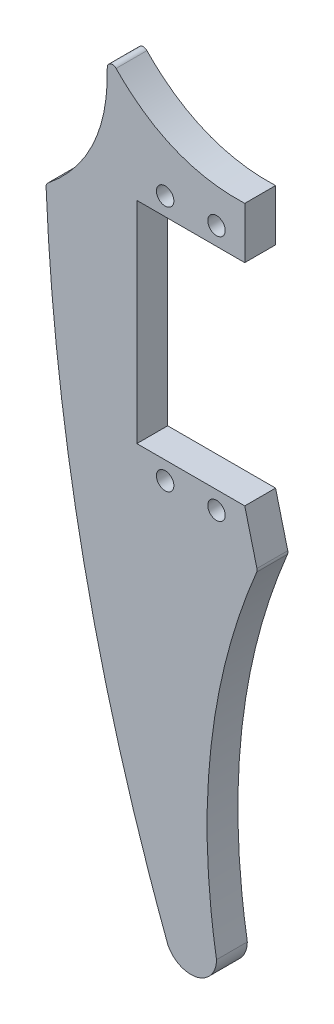
ISO-10303-21;
HEADER;
FILE_DESCRIPTION(('STEP AP214'),'2;1');
FILE_NAME('part.step','',(''),(''),'','','');
FILE_SCHEMA(('AUTOMOTIVE_DESIGN { 1 0 10303 214 1 1 1 1 }'));
ENDSEC;
DATA;
#1=APPLICATION_CONTEXT('core data for automotive mechanical design processes');
#2=APPLICATION_PROTOCOL_DEFINITION('international standard','automotive_design',2000,#1);
#3=PRODUCT_CONTEXT('',#1,'mechanical');
#4=PRODUCT('Part','Part','',(#3));
#5=PRODUCT_RELATED_PRODUCT_CATEGORY('part','',(#4));
#6=PRODUCT_DEFINITION_FORMATION('','',#4);
#7=PRODUCT_DEFINITION_CONTEXT('part definition',#1,'design');
#8=PRODUCT_DEFINITION('design','',#6,#7);
#9=PRODUCT_DEFINITION_SHAPE('','',#8);
#10=(LENGTH_UNIT() NAMED_UNIT(*) SI_UNIT(.MILLI.,.METRE.));
#11=(NAMED_UNIT(*) PLANE_ANGLE_UNIT() SI_UNIT($,.RADIAN.));
#12=(NAMED_UNIT(*) SI_UNIT($,.STERADIAN.) SOLID_ANGLE_UNIT());
#13=UNCERTAINTY_MEASURE_WITH_UNIT(LENGTH_MEASURE(1.E-05),#10,'distance_accuracy_value','');
#14=(GEOMETRIC_REPRESENTATION_CONTEXT(3) GLOBAL_UNCERTAINTY_ASSIGNED_CONTEXT((#13)) GLOBAL_UNIT_ASSIGNED_CONTEXT((#10,
#11,#12)) REPRESENTATION_CONTEXT('',''));
#15=CARTESIAN_POINT('',(0.,0.,0.));
#16=DIRECTION('',(0.,0.,1.));
#17=DIRECTION('',(1.,0.,0.));
#18=AXIS2_PLACEMENT_3D('',#15,#16,#17);
#19=CARTESIAN_POINT('',(12.9540809188379,-30.1941986179259,6.));
#20=CARTESIAN_POINT('',(-1.07020407719843,-63.2680626962871,6.));
#21=CARTESIAN_POINT('',(5.00000000000001,-99.75,6.));
#22=B_SPLINE_CURVE_WITH_KNOTS('',2,(#19,#20,#21),.UNSPECIFIED.,.F.,.F.,(3,3),(0.,1.),.UNSPECIFIED.);
#23=DIRECTION('',(0.,0.,-1.));
#24=VECTOR('',#23,1.);
#25=SURFACE_OF_LINEAR_EXTRUSION('',#22,#24);
#26=CARTESIAN_POINT('',(12.9540809188379,-30.1941986179259,0.));
#27=CARTESIAN_POINT('',(-1.07020407719843,-63.2680626962871,0.));
#28=CARTESIAN_POINT('',(5.00000000000001,-99.75,0.));
#29=B_SPLINE_CURVE_WITH_KNOTS('',2,(#26,#27,#28),.UNSPECIFIED.,.F.,.F.,(3,3),(0.,1.),.UNSPECIFIED.);
#30=CARTESIAN_POINT('',(12.823938475862,-30.502218117603,0.));
#31=VERTEX_POINT('',#30);
#32=CARTESIAN_POINT('',(5.00000000000002,-99.75,0.));
#33=VERTEX_POINT('',#32);
#34=EDGE_CURVE('E346',#31,#33,#29,.T.);
#35=ORIENTED_EDGE('',*,*,#34,.F.);
#36=DIRECTION('',(0.,0.,-1.));
#37=VECTOR('',#36,1.);
#38=CARTESIAN_POINT('',(12.823938475862,-30.502218117603,0.));
#39=LINE('',#38,#37);
#40=CARTESIAN_POINT('',(12.823938475862,-30.502218117603,6.));
#41=VERTEX_POINT('',#40);
#42=EDGE_CURVE('E250',#31,#41,#39,.F.);
#43=ORIENTED_EDGE('',*,*,#42,.T.);
#44=CARTESIAN_POINT('',(5.00000000000002,-99.75,6.));
#45=VERTEX_POINT('',#44);
#46=EDGE_CURVE('E153',#41,#45,#22,.T.);
#47=ORIENTED_EDGE('',*,*,#46,.T.);
#48=DIRECTION('',(0.,0.,-1.));
#49=VECTOR('',#48,1.);
#50=CARTESIAN_POINT('',(5.00000000000002,-99.75,6.));
#51=LINE('',#50,#49);
#52=EDGE_CURVE('E227',#45,#33,#51,.T.);
#53=ORIENTED_EDGE('',*,*,#52,.T.);
#54=EDGE_LOOP('',(#35,#43,#47,#53));
#55=FACE_BOUND('',#54,.T.);
#56=ADVANCED_FACE('F36',(#55),#25,.T.);
#57=CARTESIAN_POINT('',(4.9906148090049,1.26337132740417,6.));
#58=DIRECTION('',(0.969419861792587,0.245408091883788,0.));
#59=DIRECTION('',(-0.245408091883788,0.969419861792587,0.));
#60=AXIS2_PLACEMENT_3D('',#57,#58,#59);
#61=PLANE('',#60);
#62=DIRECTION('',(0.245408091883788,-0.969419861792587,0.));
#63=VECTOR('',#62,1.);
#64=CARTESIAN_POINT('',(4.9906148090049,1.26337132740417,6.));
#65=LINE('',#64,#63);
#66=CARTESIAN_POINT('',(10.5,-20.5,6.));
#67=VERTEX_POINT('',#66);
#68=CARTESIAN_POINT('',(12.8717052190705,-29.8687951690395,6.));
#69=VERTEX_POINT('',#68);
#70=EDGE_CURVE('E135',#67,#69,#65,.T.);
#71=ORIENTED_EDGE('',*,*,#70,.T.);
#72=DIRECTION('',(0.,0.,-1.));
#73=VECTOR('',#72,1.);
#74=CARTESIAN_POINT('',(12.8717052190705,-29.8687951690395,6.));
#75=LINE('',#74,#73);
#76=CARTESIAN_POINT('',(12.8717052190705,-29.8687951690395,0.));
#77=VERTEX_POINT('',#76);
#78=EDGE_CURVE('E143',#69,#77,#75,.T.);
#79=ORIENTED_EDGE('',*,*,#78,.T.);
#80=DIRECTION('',(0.245408091883788,-0.969419861792587,0.));
#81=VECTOR('',#80,1.);
#82=CARTESIAN_POINT('',(4.9906148090049,1.26337132740417,0.));
#83=LINE('',#82,#81);
#84=CARTESIAN_POINT('',(10.5,-20.5,0.));
#85=VERTEX_POINT('',#84);
#86=EDGE_CURVE('E138',#85,#77,#83,.T.);
#87=ORIENTED_EDGE('',*,*,#86,.F.);
#88=DIRECTION('',(0.,0.,-1.));
#89=VECTOR('',#88,1.);
#90=CARTESIAN_POINT('',(10.5,-20.5,6.));
#91=LINE('',#90,#89);
#92=EDGE_CURVE('E131',#67,#85,#91,.T.);
#93=ORIENTED_EDGE('',*,*,#92,.F.);
#94=EDGE_LOOP('',(#71,#79,#87,#93));
#95=FACE_BOUND('',#94,.T.);
#96=ADVANCED_FACE('F133',(#95),#61,.T.);
#97=CARTESIAN_POINT('',(0.,-20.5,6.));
#98=DIRECTION('',(0.,1.,0.));
#99=DIRECTION('',(0.,0.,1.));
#100=AXIS2_PLACEMENT_3D('',#97,#98,#99);
#101=PLANE('',#100);
#102=DIRECTION('',(1.,0.,0.));
#103=VECTOR('',#102,1.);
#104=CARTESIAN_POINT('',(0.,-20.5,0.));
#105=LINE('',#104,#103);
#106=CARTESIAN_POINT('',(-10.5,-20.5,0.));
#107=VERTEX_POINT('',#106);
#108=EDGE_CURVE('E354',#107,#85,#105,.T.);
#109=ORIENTED_EDGE('',*,*,#108,.F.);
#110=DIRECTION('',(0.,0.,-1.));
#111=VECTOR('',#110,1.);
#112=CARTESIAN_POINT('',(-10.5,-20.5,6.));
#113=LINE('',#112,#111);
#114=CARTESIAN_POINT('',(-10.5,-20.5,6.));
#115=VERTEX_POINT('',#114);
#116=EDGE_CURVE('E144',#115,#107,#113,.T.);
#117=ORIENTED_EDGE('',*,*,#116,.F.);
#118=DIRECTION('',(1.,0.,0.));
#119=VECTOR('',#118,1.);
#120=CARTESIAN_POINT('',(0.,-20.5,6.));
#121=LINE('',#120,#119);
#122=EDGE_CURVE('E150',#115,#67,#121,.T.);
#123=ORIENTED_EDGE('',*,*,#122,.T.);
#124=ORIENTED_EDGE('',*,*,#92,.T.);
#125=EDGE_LOOP('',(#109,#117,#123,#124));
#126=FACE_BOUND('',#125,.T.);
#127=ADVANCED_FACE('F155',(#126),#101,.T.);
#128=CARTESIAN_POINT('',(-10.5,0.,6.));
#129=DIRECTION('',(-1.,0.,0.));
#130=DIRECTION('',(0.,0.,1.));
#131=AXIS2_PLACEMENT_3D('',#128,#129,#130);
#132=PLANE('',#131);
#133=DIRECTION('',(0.,1.,0.));
#134=VECTOR('',#133,1.);
#135=CARTESIAN_POINT('',(-10.5,0.,0.));
#136=LINE('',#135,#134);
#137=CARTESIAN_POINT('',(-10.5,20.5,0.));
#138=VERTEX_POINT('',#137);
#139=EDGE_CURVE('E356',#107,#138,#136,.T.);
#140=ORIENTED_EDGE('',*,*,#139,.T.);
#141=DIRECTION('',(0.,0.,-1.));
#142=VECTOR('',#141,1.);
#143=CARTESIAN_POINT('',(-10.5,20.5,6.));
#144=LINE('',#143,#142);
#145=CARTESIAN_POINT('',(-10.5,20.5,6.));
#146=VERTEX_POINT('',#145);
#147=EDGE_CURVE('E239',#146,#138,#144,.T.);
#148=ORIENTED_EDGE('',*,*,#147,.F.);
#149=DIRECTION('',(0.,1.,0.));
#150=VECTOR('',#149,1.);
#151=CARTESIAN_POINT('',(-10.5,0.,6.));
#152=LINE('',#151,#150);
#153=EDGE_CURVE('E157',#115,#146,#152,.T.);
#154=ORIENTED_EDGE('',*,*,#153,.F.);
#155=ORIENTED_EDGE('',*,*,#116,.T.);
#156=EDGE_LOOP('',(#140,#148,#154,#155));
#157=FACE_BOUND('',#156,.T.);
#158=ADVANCED_FACE('F195',(#157),#132,.F.);
#159=CARTESIAN_POINT('',(0.,20.5,6.));
#160=DIRECTION('',(0.,1.,0.));
#161=DIRECTION('',(0.,0.,1.));
#162=AXIS2_PLACEMENT_3D('',#159,#160,#161);
#163=PLANE('',#162);
#164=DIRECTION('',(1.,0.,0.));
#165=VECTOR('',#164,1.);
#166=CARTESIAN_POINT('',(0.,20.5,0.));
#167=LINE('',#166,#165);
#168=CARTESIAN_POINT('',(10.5,20.5,0.));
#169=VERTEX_POINT('',#168);
#170=EDGE_CURVE('E358',#138,#169,#167,.T.);
#171=ORIENTED_EDGE('',*,*,#170,.T.);
#172=DIRECTION('',(0.,0.,-1.));
#173=VECTOR('',#172,1.);
#174=CARTESIAN_POINT('',(10.5,20.5,6.));
#175=LINE('',#174,#173);
#176=CARTESIAN_POINT('',(10.5,20.5,6.));
#177=VERTEX_POINT('',#176);
#178=EDGE_CURVE('E236',#177,#169,#175,.T.);
#179=ORIENTED_EDGE('',*,*,#178,.F.);
#180=DIRECTION('',(1.,0.,0.));
#181=VECTOR('',#180,1.);
#182=CARTESIAN_POINT('',(0.,20.5,6.));
#183=LINE('',#182,#181);
#184=EDGE_CURVE('E159',#146,#177,#183,.T.);
#185=ORIENTED_EDGE('',*,*,#184,.F.);
#186=ORIENTED_EDGE('',*,*,#147,.T.);
#187=EDGE_LOOP('',(#171,#179,#185,#186));
#188=FACE_BOUND('',#187,.T.);
#189=ADVANCED_FACE('F191',(#188),#163,.F.);
#190=CARTESIAN_POINT('',(10.5,0.,6.));
#191=DIRECTION('',(-1.,0.,0.));
#192=DIRECTION('',(0.,-1.,0.));
#193=AXIS2_PLACEMENT_3D('',#190,#191,#192);
#194=PLANE('',#193);
#195=DIRECTION('',(0.,1.,0.));
#196=VECTOR('',#195,1.);
#197=CARTESIAN_POINT('',(10.5,0.,0.));
#198=LINE('',#197,#196);
#199=CARTESIAN_POINT('',(10.5,30.5,0.));
#200=VERTEX_POINT('',#199);
#201=EDGE_CURVE('E277',#169,#200,#198,.T.);
#202=ORIENTED_EDGE('',*,*,#201,.T.);
#203=DIRECTION('',(0.,0.,-1.));
#204=VECTOR('',#203,1.);
#205=CARTESIAN_POINT('',(10.5,30.5,6.));
#206=LINE('',#205,#204);
#207=CARTESIAN_POINT('',(10.5,30.5,6.));
#208=VERTEX_POINT('',#207);
#209=EDGE_CURVE('E233',#208,#200,#206,.T.);
#210=ORIENTED_EDGE('',*,*,#209,.F.);
#211=DIRECTION('',(0.,1.,0.));
#212=VECTOR('',#211,1.);
#213=CARTESIAN_POINT('',(10.5,0.,6.));
#214=LINE('',#213,#212);
#215=EDGE_CURVE('E164',#177,#208,#214,.T.);
#216=ORIENTED_EDGE('',*,*,#215,.F.);
#217=ORIENTED_EDGE('',*,*,#178,.T.);
#218=EDGE_LOOP('',(#202,#210,#216,#217));
#219=FACE_BOUND('',#218,.T.);
#220=ADVANCED_FACE('F186',(#219),#194,.F.);
#221=CARTESIAN_POINT('',(10.5,30.5,6.));
#222=CARTESIAN_POINT('',(-5.46337343427479,29.9015643548486,6.));
#223=CARTESIAN_POINT('',(-16.4307628644931,42.8026304517989,6.));
#224=B_SPLINE_CURVE_WITH_KNOTS('',2,(#221,#222,#223),.UNSPECIFIED.,.F.,.F.,(3,3),(0.,1.),.UNSPECIFIED.);
#225=DIRECTION('',(0.,0.,-1.));
#226=VECTOR('',#225,1.);
#227=SURFACE_OF_LINEAR_EXTRUSION('',#224,#226);
#228=CARTESIAN_POINT('',(10.5,30.5,0.));
#229=CARTESIAN_POINT('',(-5.46337343427479,29.9015643548486,0.));
#230=CARTESIAN_POINT('',(-16.4307628644931,42.8026304517989,0.));
#231=B_SPLINE_CURVE_WITH_KNOTS('',2,(#228,#229,#230),.UNSPECIFIED.,.F.,.F.,(3,3),(0.,1.),.UNSPECIFIED.);
#232=CARTESIAN_POINT('',(-14.5455324951219,40.7227996552318,0.));
#233=VERTEX_POINT('',#232);
#234=EDGE_CURVE('E273',#200,#233,#231,.T.);
#235=ORIENTED_EDGE('',*,*,#234,.T.);
#236=DIRECTION('',(0.,0.,-1.));
#237=VECTOR('',#236,1.);
#238=CARTESIAN_POINT('',(-14.5455324951219,40.7227996552318,0.));
#239=LINE('',#238,#237);
#240=CARTESIAN_POINT('',(-14.5455324951219,40.7227996552318,6.));
#241=VERTEX_POINT('',#240);
#242=EDGE_CURVE('E11',#233,#241,#239,.F.);
#243=ORIENTED_EDGE('',*,*,#242,.T.);
#244=EDGE_CURVE('E166',#208,#241,#224,.T.);
#245=ORIENTED_EDGE('',*,*,#244,.F.);
#246=ORIENTED_EDGE('',*,*,#209,.T.);
#247=EDGE_LOOP('',(#235,#243,#245,#246));
#248=FACE_BOUND('',#247,.T.);
#249=ADVANCED_FACE('F181',(#248),#227,.F.);
#250=CARTESIAN_POINT('',(-16.4307628644931,42.8026304517989,6.));
#251=CARTESIAN_POINT('',(-14.7841142412852,25.0085084202776,6.));
#252=CARTESIAN_POINT('',(-28.192589157,14.4748516346345,6.));
#253=B_SPLINE_CURVE_WITH_KNOTS('',2,(#250,#251,#252),.UNSPECIFIED.,.F.,.F.,(3,3),(0.,1.),.UNSPECIFIED.);
#254=DIRECTION('',(0.,0.,-1.));
#255=VECTOR('',#254,1.);
#256=SURFACE_OF_LINEAR_EXTRUSION('',#253,#255);
#257=CARTESIAN_POINT('',(-16.4307628644931,42.8026304517989,0.));
#258=CARTESIAN_POINT('',(-14.7841142412852,25.0085084202776,0.));
#259=CARTESIAN_POINT('',(-28.192589157,14.4748516346345,0.));
#260=B_SPLINE_CURVE_WITH_KNOTS('',2,(#257,#258,#259),.UNSPECIFIED.,.F.,.F.,(3,3),(0.,1.),.UNSPECIFIED.);
#261=CARTESIAN_POINT('',(-16.2636389830079,40.0015359688317,0.));
#262=VERTEX_POINT('',#261);
#263=CARTESIAN_POINT('',(-27.8001451117184,14.7873108654954,0.));
#264=VERTEX_POINT('',#263);
#265=EDGE_CURVE('E263',#262,#264,#260,.T.);
#266=ORIENTED_EDGE('',*,*,#265,.T.);
#267=DIRECTION('',(0.,0.,-1.));
#268=VECTOR('',#267,1.);
#269=CARTESIAN_POINT('',(-27.8001451117184,14.7873108654954,0.));
#270=LINE('',#269,#268);
#271=CARTESIAN_POINT('',(-27.8001451117184,14.7873108654954,6.));
#272=VERTEX_POINT('',#271);
#273=EDGE_CURVE('E44',#264,#272,#270,.F.);
#274=ORIENTED_EDGE('',*,*,#273,.T.);
#275=CARTESIAN_POINT('',(-16.2636389830079,40.0015359688317,6.));
#276=VERTEX_POINT('',#275);
#277=EDGE_CURVE('E172',#276,#272,#253,.T.);
#278=ORIENTED_EDGE('',*,*,#277,.F.);
#279=DIRECTION('',(0.,0.,-1.));
#280=VECTOR('',#279,1.);
#281=CARTESIAN_POINT('',(-16.2636389830079,40.0015359688317,6.));
#282=LINE('',#281,#280);
#283=EDGE_CURVE('E259',#276,#262,#282,.T.);
#284=ORIENTED_EDGE('',*,*,#283,.T.);
#285=EDGE_LOOP('',(#266,#274,#278,#284));
#286=FACE_BOUND('',#285,.T.);
#287=ADVANCED_FACE('F185',(#286),#256,.F.);
#288=CARTESIAN_POINT('',(-28.192589157,14.4748516346345,6.));
#289=CARTESIAN_POINT('',(-25.7109785393043,-45.589378796555,6.));
#290=CARTESIAN_POINT('',(-4.43296572716946,-102.062750497079,6.));
#291=B_SPLINE_CURVE_WITH_KNOTS('',2,(#288,#289,#290),.UNSPECIFIED.,.F.,.F.,(3,3),(0.,1.),.UNSPECIFIED.);
#292=DIRECTION('',(0.,0.,-1.));
#293=VECTOR('',#292,1.);
#294=SURFACE_OF_LINEAR_EXTRUSION('',#291,#293);
#295=CARTESIAN_POINT('',(-28.1712458369104,13.9664777277511,6.));
#296=VERTEX_POINT('',#295);
#297=CARTESIAN_POINT('',(-4.43296572716946,-102.062750497079,6.));
#298=VERTEX_POINT('',#297);
#299=EDGE_CURVE('E326',#296,#298,#291,.T.);
#300=ORIENTED_EDGE('',*,*,#299,.F.);
#301=DIRECTION('',(0.,0.,-1.));
#302=VECTOR('',#301,1.);
#303=CARTESIAN_POINT('',(-28.1712458369098,13.966477727738,6.));
#304=LINE('',#303,#302);
#305=CARTESIAN_POINT('',(-28.1712458369104,13.9664777277511,0.));
#306=VERTEX_POINT('',#305);
#307=EDGE_CURVE('E256',#296,#306,#304,.T.);
#308=ORIENTED_EDGE('',*,*,#307,.T.);
#309=CARTESIAN_POINT('',(-28.192589157,14.4748516346345,0.));
#310=CARTESIAN_POINT('',(-25.7109785393043,-45.589378796555,0.));
#311=CARTESIAN_POINT('',(-4.43296572716946,-102.062750497079,0.));
#312=B_SPLINE_CURVE_WITH_KNOTS('',2,(#309,#310,#311),.UNSPECIFIED.,.F.,.F.,(3,3),(0.,1.),.UNSPECIFIED.);
#313=CARTESIAN_POINT('',(-4.43296572716946,-102.062750497079,0.));
#314=VERTEX_POINT('',#313);
#315=EDGE_CURVE('E272',#306,#314,#312,.T.);
#316=ORIENTED_EDGE('',*,*,#315,.T.);
#317=DIRECTION('',(0.,0.,-1.));
#318=VECTOR('',#317,1.);
#319=CARTESIAN_POINT('',(-4.43296572716946,-102.062750497079,6.));
#320=LINE('',#319,#318);
#321=EDGE_CURVE('E229',#298,#314,#320,.T.);
#322=ORIENTED_EDGE('',*,*,#321,.F.);
#323=EDGE_LOOP('',(#300,#308,#316,#322));
#324=FACE_BOUND('',#323,.T.);
#325=ADVANCED_FACE('F315',(#324),#294,.F.);
#326=CARTESIAN_POINT('',(5.,24.,6.));
#327=DIRECTION('',(0.,0.,-1.));
#328=DIRECTION('',(-1.,0.,0.));
#329=AXIS2_PLACEMENT_3D('',#326,#327,#328);
#330=CYLINDRICAL_SURFACE('',#329,1.7);
#331=CARTESIAN_POINT('',(5.,24.,6.));
#332=DIRECTION('',(0.,0.,1.));
#333=DIRECTION('',(1.,0.,0.));
#334=AXIS2_PLACEMENT_3D('',#331,#332,#333);
#335=CIRCLE('',#334,1.7);
#336=CARTESIAN_POINT('',(6.7,24.,6.));
#337=VERTEX_POINT('',#336);
#338=EDGE_CURVE('E341',#337,#337,#335,.T.);
#339=ORIENTED_EDGE('',*,*,#338,.T.);
#340=EDGE_LOOP('',(#339));
#341=FACE_BOUND('',#340,.T.);
#342=CARTESIAN_POINT('',(5.,24.,0.));
#343=DIRECTION('',(0.,0.,1.));
#344=DIRECTION('',(1.,0.,0.));
#345=AXIS2_PLACEMENT_3D('',#342,#343,#344);
#346=CIRCLE('',#345,1.7);
#347=CARTESIAN_POINT('',(6.7,24.,0.));
#348=VERTEX_POINT('',#347);
#349=EDGE_CURVE('E218',#348,#348,#346,.T.);
#350=ORIENTED_EDGE('',*,*,#349,.F.);
#351=EDGE_LOOP('',(#350));
#352=FACE_BOUND('',#351,.T.);
#353=ADVANCED_FACE('F305',(#341,#352),#330,.F.);
#354=CARTESIAN_POINT('',(5.0000000000005,-24.,6.));
#355=DIRECTION('',(0.,0.,-1.));
#356=DIRECTION('',(-1.,0.,0.));
#357=AXIS2_PLACEMENT_3D('',#354,#355,#356);
#358=CYLINDRICAL_SURFACE('',#357,1.7);
#359=CARTESIAN_POINT('',(5.0000000000005,-24.,6.));
#360=DIRECTION('',(0.,0.,1.));
#361=DIRECTION('',(1.,0.,0.));
#362=AXIS2_PLACEMENT_3D('',#359,#360,#361);
#363=CIRCLE('',#362,1.7);
#364=CARTESIAN_POINT('',(6.7000000000005,-24.,6.));
#365=VERTEX_POINT('',#364);
#366=EDGE_CURVE('E339',#365,#365,#363,.T.);
#367=ORIENTED_EDGE('',*,*,#366,.T.);
#368=EDGE_LOOP('',(#367));
#369=FACE_BOUND('',#368,.T.);
#370=CARTESIAN_POINT('',(5.0000000000005,-24.,0.));
#371=DIRECTION('',(0.,0.,1.));
#372=DIRECTION('',(1.,0.,0.));
#373=AXIS2_PLACEMENT_3D('',#370,#371,#372);
#374=CIRCLE('',#373,1.7);
#375=CARTESIAN_POINT('',(6.7000000000005,-24.,0.));
#376=VERTEX_POINT('',#375);
#377=EDGE_CURVE('E223',#376,#376,#374,.T.);
#378=ORIENTED_EDGE('',*,*,#377,.F.);
#379=EDGE_LOOP('',(#378));
#380=FACE_BOUND('',#379,.T.);
#381=ADVANCED_FACE('F302',(#369,#380),#358,.F.);
#382=CARTESIAN_POINT('',(-4.9999999999995,-24.,6.));
#383=DIRECTION('',(0.,0.,-1.));
#384=DIRECTION('',(-1.,0.,0.));
#385=AXIS2_PLACEMENT_3D('',#382,#383,#384);
#386=CYLINDRICAL_SURFACE('',#385,1.7);
#387=CARTESIAN_POINT('',(-4.9999999999995,-24.,6.));
#388=DIRECTION('',(0.,0.,1.));
#389=DIRECTION('',(1.,0.,0.));
#390=AXIS2_PLACEMENT_3D('',#387,#388,#389);
#391=CIRCLE('',#390,1.7);
#392=CARTESIAN_POINT('',(-3.2999999999995,-24.,6.));
#393=VERTEX_POINT('',#392);
#394=EDGE_CURVE('E336',#393,#393,#391,.T.);
#395=ORIENTED_EDGE('',*,*,#394,.T.);
#396=EDGE_LOOP('',(#395));
#397=FACE_BOUND('',#396,.T.);
#398=CARTESIAN_POINT('',(-4.9999999999995,-24.,0.));
#399=DIRECTION('',(0.,0.,1.));
#400=DIRECTION('',(1.,0.,0.));
#401=AXIS2_PLACEMENT_3D('',#398,#399,#400);
#402=CIRCLE('',#401,1.7);
#403=CARTESIAN_POINT('',(-3.2999999999995,-24.,0.));
#404=VERTEX_POINT('',#403);
#405=EDGE_CURVE('E295',#404,#404,#402,.T.);
#406=ORIENTED_EDGE('',*,*,#405,.F.);
#407=EDGE_LOOP('',(#406));
#408=FACE_BOUND('',#407,.T.);
#409=ADVANCED_FACE('F304',(#397,#408),#386,.F.);
#410=CARTESIAN_POINT('',(0.,-99.75,6.));
#411=DIRECTION('',(0.,0.,-1.));
#412=DIRECTION('',(-1.,0.,0.));
#413=AXIS2_PLACEMENT_3D('',#410,#411,#412);
#414=CYLINDRICAL_SURFACE('',#413,5.);
#415=CARTESIAN_POINT('',(0.,-99.75,0.));
#416=DIRECTION('',(0.,0.,1.));
#417=DIRECTION('',(1.,0.,0.));
#418=AXIS2_PLACEMENT_3D('',#415,#416,#417);
#419=CIRCLE('',#418,5.);
#420=EDGE_CURVE('E275',#314,#33,#419,.T.);
#421=ORIENTED_EDGE('',*,*,#420,.T.);
#422=ORIENTED_EDGE('',*,*,#52,.F.);
#423=CARTESIAN_POINT('',(0.,-99.75,6.));
#424=DIRECTION('',(0.,0.,1.));
#425=DIRECTION('',(1.,0.,0.));
#426=AXIS2_PLACEMENT_3D('',#423,#424,#425);
#427=CIRCLE('',#426,5.);
#428=EDGE_CURVE('E331',#298,#45,#427,.T.);
#429=ORIENTED_EDGE('',*,*,#428,.F.);
#430=ORIENTED_EDGE('',*,*,#321,.T.);
#431=EDGE_LOOP('',(#421,#422,#429,#430));
#432=FACE_BOUND('',#431,.T.);
#433=ADVANCED_FACE('F312',(#432),#414,.T.);
#434=CARTESIAN_POINT('',(-5.,24.,6.));
#435=DIRECTION('',(0.,0.,-1.));
#436=DIRECTION('',(-1.,0.,0.));
#437=AXIS2_PLACEMENT_3D('',#434,#435,#436);
#438=CYLINDRICAL_SURFACE('',#437,1.7);
#439=CARTESIAN_POINT('',(-5.,24.,6.));
#440=DIRECTION('',(0.,0.,1.));
#441=DIRECTION('',(1.,0.,0.));
#442=AXIS2_PLACEMENT_3D('',#439,#440,#441);
#443=CIRCLE('',#442,1.7);
#444=CARTESIAN_POINT('',(-3.3,24.,6.));
#445=VERTEX_POINT('',#444);
#446=EDGE_CURVE('E230',#445,#445,#443,.T.);
#447=ORIENTED_EDGE('',*,*,#446,.T.);
#448=EDGE_LOOP('',(#447));
#449=FACE_BOUND('',#448,.T.);
#450=CARTESIAN_POINT('',(-5.,24.,0.));
#451=DIRECTION('',(0.,0.,1.));
#452=DIRECTION('',(1.,0.,0.));
#453=AXIS2_PLACEMENT_3D('',#450,#451,#452);
#454=CIRCLE('',#453,1.7);
#455=CARTESIAN_POINT('',(-3.3,24.,0.));
#456=VERTEX_POINT('',#455);
#457=EDGE_CURVE('E211',#456,#456,#454,.T.);
#458=ORIENTED_EDGE('',*,*,#457,.F.);
#459=EDGE_LOOP('',(#458));
#460=FACE_BOUND('',#459,.T.);
#461=ADVANCED_FACE('F322',(#449,#460),#438,.F.);
#462=CARTESIAN_POINT('',(0.,0.,6.));
#463=DIRECTION('',(0.,0.,1.));
#464=DIRECTION('',(1.,0.,0.));
#465=AXIS2_PLACEMENT_3D('',#462,#463,#464);
#466=PLANE('',#465);
#467=ORIENTED_EDGE('',*,*,#46,.F.);
#468=CARTESIAN_POINT('',(11.9022853572779,-30.1142032609233,6.));
#469=DIRECTION('',(0.,0.,1.));
#470=DIRECTION('',(1.,0.,0.));
#471=AXIS2_PLACEMENT_3D('',#468,#469,#470);
#472=CIRCLE('',#471,1.);
#473=EDGE_CURVE('E152',#41,#69,#472,.T.);
#474=ORIENTED_EDGE('',*,*,#473,.T.);
#475=ORIENTED_EDGE('',*,*,#70,.F.);
#476=ORIENTED_EDGE('',*,*,#122,.F.);
#477=ORIENTED_EDGE('',*,*,#153,.T.);
#478=ORIENTED_EDGE('',*,*,#184,.T.);
#479=ORIENTED_EDGE('',*,*,#215,.T.);
#480=ORIENTED_EDGE('',*,*,#244,.T.);
#481=CARTESIAN_POINT('',(-15.2639685285624,40.0272066234565,6.));
#482=DIRECTION('',(0.,0.,1.));
#483=DIRECTION('',(1.,0.,0.));
#484=AXIS2_PLACEMENT_3D('',#481,#482,#483);
#485=CIRCLE('',#484,1.);
#486=EDGE_CURVE('E252',#241,#276,#485,.T.);
#487=ORIENTED_EDGE('',*,*,#486,.T.);
#488=ORIENTED_EDGE('',*,*,#277,.T.);
#489=CARTESIAN_POINT('',(-27.1721541618547,14.0090902239745,6.));
#490=DIRECTION('',(0.,0.,1.));
#491=DIRECTION('',(1.,0.,0.));
#492=AXIS2_PLACEMENT_3D('',#489,#490,#491);
#493=CIRCLE('',#492,1.);
#494=EDGE_CURVE('E51',#272,#296,#493,.T.);
#495=ORIENTED_EDGE('',*,*,#494,.T.);
#496=ORIENTED_EDGE('',*,*,#299,.T.);
#497=ORIENTED_EDGE('',*,*,#428,.T.);
#498=EDGE_LOOP('',(#467,#474,#475,#476,#477,#478,#479,#480,#487,#488,#495,#496,#497));
#499=FACE_BOUND('',#498,.T.);
#500=ORIENTED_EDGE('',*,*,#394,.F.);
#501=EDGE_LOOP('',(#500));
#502=FACE_BOUND('',#501,.T.);
#503=ORIENTED_EDGE('',*,*,#366,.F.);
#504=EDGE_LOOP('',(#503));
#505=FACE_BOUND('',#504,.T.);
#506=ORIENTED_EDGE('',*,*,#338,.F.);
#507=EDGE_LOOP('',(#506));
#508=FACE_BOUND('',#507,.T.);
#509=ORIENTED_EDGE('',*,*,#446,.F.);
#510=EDGE_LOOP('',(#509));
#511=FACE_BOUND('',#510,.T.);
#512=ADVANCED_FACE('F148',(#499,#502,#505,#508,#511),#466,.T.);
#513=CARTESIAN_POINT('',(0.,0.,0.));
#514=DIRECTION('',(0.,0.,1.));
#515=DIRECTION('',(1.,0.,0.));
#516=AXIS2_PLACEMENT_3D('',#513,#514,#515);
#517=PLANE('',#516);
#518=ORIENTED_EDGE('',*,*,#86,.T.);
#519=CARTESIAN_POINT('',(11.9022853572779,-30.1142032609233,0.));
#520=DIRECTION('',(0.,0.,1.));
#521=DIRECTION('',(1.,0.,0.));
#522=AXIS2_PLACEMENT_3D('',#519,#520,#521);
#523=CIRCLE('',#522,1.);
#524=EDGE_CURVE('E248',#77,#31,#523,.F.);
#525=ORIENTED_EDGE('',*,*,#524,.T.);
#526=ORIENTED_EDGE('',*,*,#34,.T.);
#527=ORIENTED_EDGE('',*,*,#420,.F.);
#528=ORIENTED_EDGE('',*,*,#315,.F.);
#529=CARTESIAN_POINT('',(-27.1721541618547,14.0090902239745,0.));
#530=DIRECTION('',(0.,0.,1.));
#531=DIRECTION('',(1.,0.,0.));
#532=AXIS2_PLACEMENT_3D('',#529,#530,#531);
#533=CIRCLE('',#532,1.);
#534=EDGE_CURVE('E246',#306,#264,#533,.F.);
#535=ORIENTED_EDGE('',*,*,#534,.T.);
#536=ORIENTED_EDGE('',*,*,#265,.F.);
#537=CARTESIAN_POINT('',(-15.2639685285624,40.0272066234565,0.));
#538=DIRECTION('',(0.,0.,1.));
#539=DIRECTION('',(1.,0.,0.));
#540=AXIS2_PLACEMENT_3D('',#537,#538,#539);
#541=CIRCLE('',#540,1.);
#542=EDGE_CURVE('E244',#262,#233,#541,.F.);
#543=ORIENTED_EDGE('',*,*,#542,.T.);
#544=ORIENTED_EDGE('',*,*,#234,.F.);
#545=ORIENTED_EDGE('',*,*,#201,.F.);
#546=ORIENTED_EDGE('',*,*,#170,.F.);
#547=ORIENTED_EDGE('',*,*,#139,.F.);
#548=ORIENTED_EDGE('',*,*,#108,.T.);
#549=EDGE_LOOP('',(#518,#525,#526,#527,#528,#535,#536,#543,#544,#545,#546,#547,#548));
#550=FACE_BOUND('',#549,.T.);
#551=ORIENTED_EDGE('',*,*,#405,.T.);
#552=EDGE_LOOP('',(#551));
#553=FACE_BOUND('',#552,.T.);
#554=ORIENTED_EDGE('',*,*,#377,.T.);
#555=EDGE_LOOP('',(#554));
#556=FACE_BOUND('',#555,.T.);
#557=ORIENTED_EDGE('',*,*,#349,.T.);
#558=EDGE_LOOP('',(#557));
#559=FACE_BOUND('',#558,.T.);
#560=ORIENTED_EDGE('',*,*,#457,.T.);
#561=EDGE_LOOP('',(#560));
#562=FACE_BOUND('',#561,.T.);
#563=ADVANCED_FACE('F267',(#550,#553,#556,#559,#562),#517,.F.);
#564=CARTESIAN_POINT('',(11.9022853572779,-30.1142032609233,3.));
#565=DIRECTION('',(0.,0.,-1.));
#566=DIRECTION('',(-1.,0.,0.));
#567=AXIS2_PLACEMENT_3D('',#564,#565,#566);
#568=CYLINDRICAL_SURFACE('',#567,1.);
#569=ORIENTED_EDGE('',*,*,#473,.F.);
#570=ORIENTED_EDGE('',*,*,#42,.F.);
#571=ORIENTED_EDGE('',*,*,#524,.F.);
#572=ORIENTED_EDGE('',*,*,#78,.F.);
#573=EDGE_LOOP('',(#569,#570,#571,#572));
#574=FACE_BOUND('',#573,.T.);
#575=ADVANCED_FACE('F207',(#574),#568,.T.);
#576=CARTESIAN_POINT('',(-27.1721541618547,14.0090902239745,3.));
#577=DIRECTION('',(0.,0.,-1.));
#578=DIRECTION('',(-1.,0.,0.));
#579=AXIS2_PLACEMENT_3D('',#576,#577,#578);
#580=CYLINDRICAL_SURFACE('',#579,1.);
#581=ORIENTED_EDGE('',*,*,#494,.F.);
#582=ORIENTED_EDGE('',*,*,#273,.F.);
#583=ORIENTED_EDGE('',*,*,#534,.F.);
#584=ORIENTED_EDGE('',*,*,#307,.F.);
#585=EDGE_LOOP('',(#581,#582,#583,#584));
#586=FACE_BOUND('',#585,.T.);
#587=ADVANCED_FACE('F367',(#586),#580,.T.);
#588=CARTESIAN_POINT('',(-15.2639685285624,40.0272066234565,3.));
#589=DIRECTION('',(0.,0.,-1.));
#590=DIRECTION('',(-1.,0.,0.));
#591=AXIS2_PLACEMENT_3D('',#588,#589,#590);
#592=CYLINDRICAL_SURFACE('',#591,1.);
#593=ORIENTED_EDGE('',*,*,#486,.F.);
#594=ORIENTED_EDGE('',*,*,#242,.F.);
#595=ORIENTED_EDGE('',*,*,#542,.F.);
#596=ORIENTED_EDGE('',*,*,#283,.F.);
#597=EDGE_LOOP('',(#593,#594,#595,#596));
#598=FACE_BOUND('',#597,.T.);
#599=ADVANCED_FACE('F38',(#598),#592,.T.);
#600=CLOSED_SHELL('',(#56,#96,#127,#158,#189,#220,#249,#287,#325,#353,#381,#409,#433,#461,#512,
#563,#575,#587,#599));
#601=MANIFOLD_SOLID_BREP('B2',#600);
#602=ADVANCED_BREP_SHAPE_REPRESENTATION('',(#18,#601),#14);
#603=SHAPE_DEFINITION_REPRESENTATION(#9,#602);
ENDSEC;
END-ISO-10303-21;
